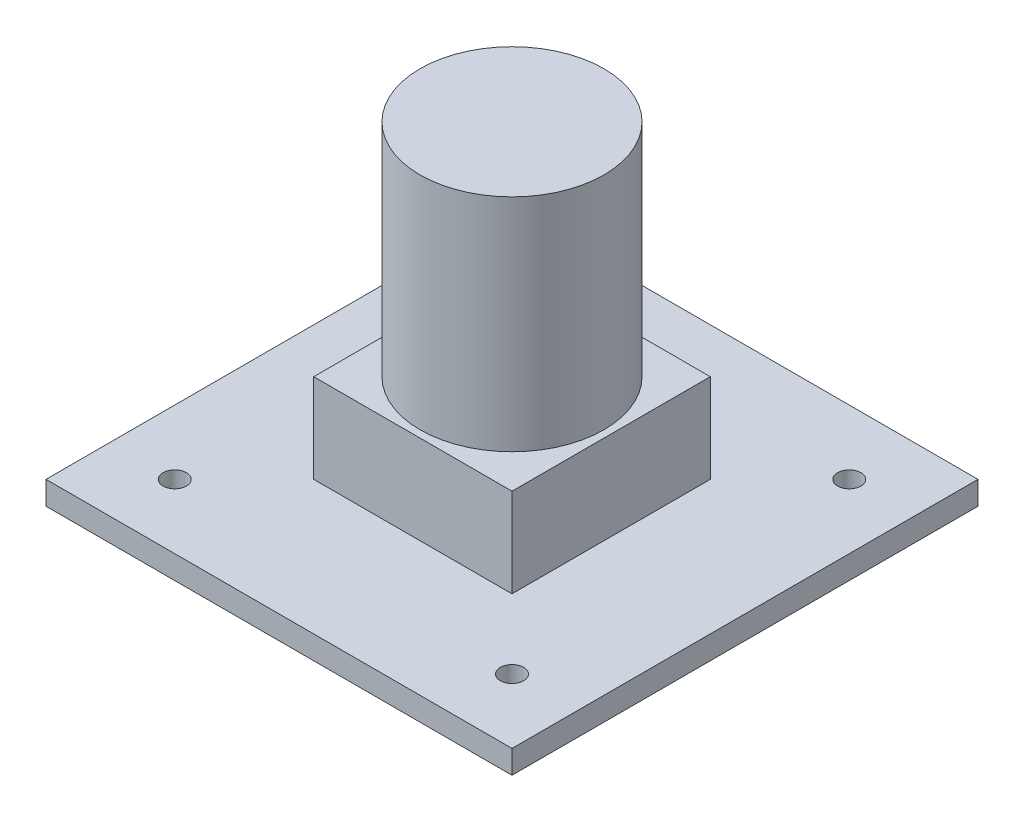
ISO-10303-21;
HEADER;
FILE_DESCRIPTION(('STEP AP214'),'2;1');
FILE_NAME('part.step','',(''),(''),'','','');
FILE_SCHEMA(('AUTOMOTIVE_DESIGN { 1 0 10303 214 1 1 1 1 }'));
ENDSEC;
DATA;
#1=APPLICATION_CONTEXT('core data for automotive mechanical design processes');
#2=APPLICATION_PROTOCOL_DEFINITION('international standard','automotive_design',2000,#1);
#3=PRODUCT_CONTEXT('',#1,'mechanical');
#4=PRODUCT('Part','Part','',(#3));
#5=PRODUCT_RELATED_PRODUCT_CATEGORY('part','',(#4));
#6=PRODUCT_DEFINITION_FORMATION('','',#4);
#7=PRODUCT_DEFINITION_CONTEXT('part definition',#1,'design');
#8=PRODUCT_DEFINITION('design','',#6,#7);
#9=PRODUCT_DEFINITION_SHAPE('','',#8);
#10=(LENGTH_UNIT() NAMED_UNIT(*) SI_UNIT(.MILLI.,.METRE.));
#11=(NAMED_UNIT(*) PLANE_ANGLE_UNIT() SI_UNIT($,.RADIAN.));
#12=(NAMED_UNIT(*) SI_UNIT($,.STERADIAN.) SOLID_ANGLE_UNIT());
#13=UNCERTAINTY_MEASURE_WITH_UNIT(LENGTH_MEASURE(1.E-05),#10,'distance_accuracy_value','');
#14=(GEOMETRIC_REPRESENTATION_CONTEXT(3) GLOBAL_UNCERTAINTY_ASSIGNED_CONTEXT((#13)) GLOBAL_UNIT_ASSIGNED_CONTEXT((#10,
#11,#12)) REPRESENTATION_CONTEXT('',''));
#15=CARTESIAN_POINT('',(0.,0.,0.));
#16=DIRECTION('',(0.,0.,1.));
#17=DIRECTION('',(1.,0.,0.));
#18=AXIS2_PLACEMENT_3D('',#15,#16,#17);
#19=CARTESIAN_POINT('',(0.,1.9,0.));
#20=DIRECTION('',(0.,1.,0.));
#21=DIRECTION('',(0.,0.,1.));
#22=AXIS2_PLACEMENT_3D('',#19,#20,#21);
#23=PLANE('',#22);
#24=CARTESIAN_POINT('',(-13.75,1.9,13.75));
#25=DIRECTION('',(0.,1.,0.));
#26=DIRECTION('',(0.,0.,1.));
#27=AXIS2_PLACEMENT_3D('',#24,#25,#26);
#28=CIRCLE('',#27,0.949999999999999);
#29=CARTESIAN_POINT('',(-13.75,1.9,14.7));
#30=VERTEX_POINT('',#29);
#31=EDGE_CURVE('E189',#30,#30,#28,.T.);
#32=ORIENTED_EDGE('',*,*,#31,.F.);
#33=EDGE_LOOP('',(#32));
#34=FACE_BOUND('',#33,.T.);
#35=CARTESIAN_POINT('',(13.75,1.9,13.75));
#36=DIRECTION('',(0.,1.,0.));
#37=DIRECTION('',(0.,0.,1.));
#38=AXIS2_PLACEMENT_3D('',#35,#36,#37);
#39=CIRCLE('',#38,0.949999999999999);
#40=CARTESIAN_POINT('',(13.75,1.9,14.7));
#41=VERTEX_POINT('',#40);
#42=EDGE_CURVE('E179',#41,#41,#39,.T.);
#43=ORIENTED_EDGE('',*,*,#42,.F.);
#44=EDGE_LOOP('',(#43));
#45=FACE_BOUND('',#44,.T.);
#46=CARTESIAN_POINT('',(13.75,1.9,-13.75));
#47=DIRECTION('',(0.,1.,0.));
#48=DIRECTION('',(0.,0.,1.));
#49=AXIS2_PLACEMENT_3D('',#46,#47,#48);
#50=CIRCLE('',#49,0.949999999999999);
#51=CARTESIAN_POINT('',(13.75,1.9,-12.8));
#52=VERTEX_POINT('',#51);
#53=EDGE_CURVE('E176',#52,#52,#50,.T.);
#54=ORIENTED_EDGE('',*,*,#53,.F.);
#55=EDGE_LOOP('',(#54));
#56=FACE_BOUND('',#55,.T.);
#57=CARTESIAN_POINT('',(-13.75,1.9,-13.75));
#58=DIRECTION('',(0.,1.,0.));
#59=DIRECTION('',(0.,0.,1.));
#60=AXIS2_PLACEMENT_3D('',#57,#58,#59);
#61=CIRCLE('',#60,0.949999999999999);
#62=CARTESIAN_POINT('',(-13.75,1.9,-12.8));
#63=VERTEX_POINT('',#62);
#64=EDGE_CURVE('E173',#63,#63,#61,.T.);
#65=ORIENTED_EDGE('',*,*,#64,.F.);
#66=EDGE_LOOP('',(#65));
#67=FACE_BOUND('',#66,.T.);
#68=DIRECTION('',(0.,0.,-1.));
#69=VECTOR('',#68,1.);
#70=CARTESIAN_POINT('',(19.,1.9,-19.));
#71=LINE('',#70,#69);
#72=CARTESIAN_POINT('',(19.,1.9,19.));
#73=VERTEX_POINT('',#72);
#74=CARTESIAN_POINT('',(19.,1.9,-19.));
#75=VERTEX_POINT('',#74);
#76=EDGE_CURVE('E153',#73,#75,#71,.T.);
#77=ORIENTED_EDGE('',*,*,#76,.T.);
#78=DIRECTION('',(-1.,0.,0.));
#79=VECTOR('',#78,1.);
#80=CARTESIAN_POINT('',(-19.,1.9,-19.));
#81=LINE('',#80,#79);
#82=CARTESIAN_POINT('',(-19.,1.9,-19.));
#83=VERTEX_POINT('',#82);
#84=EDGE_CURVE('E98',#75,#83,#81,.T.);
#85=ORIENTED_EDGE('',*,*,#84,.T.);
#86=DIRECTION('',(0.,0.,1.));
#87=VECTOR('',#86,1.);
#88=CARTESIAN_POINT('',(-19.,1.9,-19.));
#89=LINE('',#88,#87);
#90=CARTESIAN_POINT('',(-19.,1.9,19.));
#91=VERTEX_POINT('',#90);
#92=EDGE_CURVE('E156',#83,#91,#89,.T.);
#93=ORIENTED_EDGE('',*,*,#92,.T.);
#94=DIRECTION('',(1.,0.,0.));
#95=VECTOR('',#94,1.);
#96=CARTESIAN_POINT('',(-19.,1.9,19.));
#97=LINE('',#96,#95);
#98=EDGE_CURVE('E70',#91,#73,#97,.T.);
#99=ORIENTED_EDGE('',*,*,#98,.T.);
#100=EDGE_LOOP('',(#77,#85,#93,#99));
#101=FACE_BOUND('',#100,.T.);
#102=DIRECTION('',(-1.,0.,0.));
#103=VECTOR('',#102,1.);
#104=CARTESIAN_POINT('',(-8.085,1.9,-8.085));
#105=LINE('',#104,#103);
#106=CARTESIAN_POINT('',(8.085,1.9,-8.085));
#107=VERTEX_POINT('',#106);
#108=CARTESIAN_POINT('',(-8.085,1.9,-8.085));
#109=VERTEX_POINT('',#108);
#110=EDGE_CURVE('E203',#107,#109,#105,.T.);
#111=ORIENTED_EDGE('',*,*,#110,.F.);
#112=DIRECTION('',(0.,0.,-1.));
#113=VECTOR('',#112,1.);
#114=CARTESIAN_POINT('',(8.085,1.9,-8.085));
#115=LINE('',#114,#113);
#116=CARTESIAN_POINT('',(8.085,1.9,8.085));
#117=VERTEX_POINT('',#116);
#118=EDGE_CURVE('E143',#117,#107,#115,.T.);
#119=ORIENTED_EDGE('',*,*,#118,.F.);
#120=DIRECTION('',(1.,0.,0.));
#121=VECTOR('',#120,1.);
#122=CARTESIAN_POINT('',(-8.085,1.9,8.085));
#123=LINE('',#122,#121);
#124=CARTESIAN_POINT('',(-8.085,1.9,8.085));
#125=VERTEX_POINT('',#124);
#126=EDGE_CURVE('E139',#125,#117,#123,.T.);
#127=ORIENTED_EDGE('',*,*,#126,.F.);
#128=DIRECTION('',(0.,0.,1.));
#129=VECTOR('',#128,1.);
#130=CARTESIAN_POINT('',(-8.085,1.9,-8.085));
#131=LINE('',#130,#129);
#132=EDGE_CURVE('E205',#109,#125,#131,.T.);
#133=ORIENTED_EDGE('',*,*,#132,.F.);
#134=EDGE_LOOP('',(#111,#119,#127,#133));
#135=FACE_BOUND('',#134,.T.);
#136=ADVANCED_FACE('F44',(#34,#45,#56,#67,#101,#135),#23,.T.);
#137=CARTESIAN_POINT('',(19.,1.9,-19.));
#138=DIRECTION('',(-1.,0.,0.));
#139=DIRECTION('',(0.,0.,1.));
#140=AXIS2_PLACEMENT_3D('',#137,#138,#139);
#141=PLANE('',#140);
#142=DIRECTION('',(0.,0.,-1.));
#143=VECTOR('',#142,1.);
#144=CARTESIAN_POINT('',(19.,0.,-19.));
#145=LINE('',#144,#143);
#146=CARTESIAN_POINT('',(19.,0.,19.));
#147=VERTEX_POINT('',#146);
#148=CARTESIAN_POINT('',(19.,0.,-19.));
#149=VERTEX_POINT('',#148);
#150=EDGE_CURVE('E145',#147,#149,#145,.T.);
#151=ORIENTED_EDGE('',*,*,#150,.T.);
#152=DIRECTION('',(0.,-1.,0.));
#153=VECTOR('',#152,1.);
#154=CARTESIAN_POINT('',(19.,1.9,-19.));
#155=LINE('',#154,#153);
#156=EDGE_CURVE('E13',#75,#149,#155,.T.);
#157=ORIENTED_EDGE('',*,*,#156,.F.);
#158=ORIENTED_EDGE('',*,*,#76,.F.);
#159=DIRECTION('',(0.,-1.,0.));
#160=VECTOR('',#159,1.);
#161=CARTESIAN_POINT('',(19.,1.9,19.));
#162=LINE('',#161,#160);
#163=EDGE_CURVE('E158',#73,#147,#162,.T.);
#164=ORIENTED_EDGE('',*,*,#163,.T.);
#165=EDGE_LOOP('',(#151,#157,#158,#164));
#166=FACE_BOUND('',#165,.T.);
#167=ADVANCED_FACE('F46',(#166),#141,.F.);
#168=CARTESIAN_POINT('',(-19.,1.9,-19.));
#169=DIRECTION('',(0.,0.,1.));
#170=DIRECTION('',(1.,0.,0.));
#171=AXIS2_PLACEMENT_3D('',#168,#169,#170);
#172=PLANE('',#171);
#173=DIRECTION('',(-1.,0.,0.));
#174=VECTOR('',#173,1.);
#175=CARTESIAN_POINT('',(-19.,0.,-19.));
#176=LINE('',#175,#174);
#177=CARTESIAN_POINT('',(-19.,0.,-19.));
#178=VERTEX_POINT('',#177);
#179=EDGE_CURVE('E148',#149,#178,#176,.T.);
#180=ORIENTED_EDGE('',*,*,#179,.T.);
#181=DIRECTION('',(0.,-1.,0.));
#182=VECTOR('',#181,1.);
#183=CARTESIAN_POINT('',(-19.,1.9,-19.));
#184=LINE('',#183,#182);
#185=EDGE_CURVE('E53',#83,#178,#184,.T.);
#186=ORIENTED_EDGE('',*,*,#185,.F.);
#187=ORIENTED_EDGE('',*,*,#84,.F.);
#188=ORIENTED_EDGE('',*,*,#156,.T.);
#189=EDGE_LOOP('',(#180,#186,#187,#188));
#190=FACE_BOUND('',#189,.T.);
#191=ADVANCED_FACE('F230',(#190),#172,.F.);
#192=CARTESIAN_POINT('',(-19.,1.9,-19.));
#193=DIRECTION('',(1.,0.,0.));
#194=DIRECTION('',(0.,0.,-1.));
#195=AXIS2_PLACEMENT_3D('',#192,#193,#194);
#196=PLANE('',#195);
#197=DIRECTION('',(0.,0.,1.));
#198=VECTOR('',#197,1.);
#199=CARTESIAN_POINT('',(-19.,0.,-19.));
#200=LINE('',#199,#198);
#201=CARTESIAN_POINT('',(-19.,0.,19.));
#202=VERTEX_POINT('',#201);
#203=EDGE_CURVE('E161',#178,#202,#200,.T.);
#204=ORIENTED_EDGE('',*,*,#203,.T.);
#205=DIRECTION('',(0.,-1.,0.));
#206=VECTOR('',#205,1.);
#207=CARTESIAN_POINT('',(-19.,1.9,19.));
#208=LINE('',#207,#206);
#209=EDGE_CURVE('E165',#91,#202,#208,.T.);
#210=ORIENTED_EDGE('',*,*,#209,.F.);
#211=ORIENTED_EDGE('',*,*,#92,.F.);
#212=ORIENTED_EDGE('',*,*,#185,.T.);
#213=EDGE_LOOP('',(#204,#210,#211,#212));
#214=FACE_BOUND('',#213,.T.);
#215=ADVANCED_FACE('F244',(#214),#196,.F.);
#216=CARTESIAN_POINT('',(-19.,1.9,19.));
#217=DIRECTION('',(0.,0.,-1.));
#218=DIRECTION('',(-1.,0.,0.));
#219=AXIS2_PLACEMENT_3D('',#216,#217,#218);
#220=PLANE('',#219);
#221=DIRECTION('',(1.,0.,0.));
#222=VECTOR('',#221,1.);
#223=CARTESIAN_POINT('',(-19.,0.,19.));
#224=LINE('',#223,#222);
#225=EDGE_CURVE('E91',#202,#147,#224,.T.);
#226=ORIENTED_EDGE('',*,*,#225,.T.);
#227=ORIENTED_EDGE('',*,*,#163,.F.);
#228=ORIENTED_EDGE('',*,*,#98,.F.);
#229=ORIENTED_EDGE('',*,*,#209,.T.);
#230=EDGE_LOOP('',(#226,#227,#228,#229));
#231=FACE_BOUND('',#230,.T.);
#232=ADVANCED_FACE('F240',(#231),#220,.F.);
#233=CARTESIAN_POINT('',(0.,0.,0.));
#234=DIRECTION('',(0.,1.,0.));
#235=DIRECTION('',(0.,0.,1.));
#236=AXIS2_PLACEMENT_3D('',#233,#234,#235);
#237=PLANE('',#236);
#238=CARTESIAN_POINT('',(-13.75,0.,13.75));
#239=DIRECTION('',(0.,1.,0.));
#240=DIRECTION('',(0.,0.,1.));
#241=AXIS2_PLACEMENT_3D('',#238,#239,#240);
#242=CIRCLE('',#241,0.949999999999999);
#243=CARTESIAN_POINT('',(-13.75,0.,14.7));
#244=VERTEX_POINT('',#243);
#245=EDGE_CURVE('E48',#244,#244,#242,.T.);
#246=ORIENTED_EDGE('',*,*,#245,.T.);
#247=EDGE_LOOP('',(#246));
#248=FACE_BOUND('',#247,.T.);
#249=CARTESIAN_POINT('',(13.75,0.,13.75));
#250=DIRECTION('',(0.,1.,0.));
#251=DIRECTION('',(0.,0.,1.));
#252=AXIS2_PLACEMENT_3D('',#249,#250,#251);
#253=CIRCLE('',#252,0.949999999999999);
#254=CARTESIAN_POINT('',(13.75,0.,14.7));
#255=VERTEX_POINT('',#254);
#256=EDGE_CURVE('E177',#255,#255,#253,.T.);
#257=ORIENTED_EDGE('',*,*,#256,.T.);
#258=EDGE_LOOP('',(#257));
#259=FACE_BOUND('',#258,.T.);
#260=CARTESIAN_POINT('',(13.75,0.,-13.75));
#261=DIRECTION('',(0.,1.,0.));
#262=DIRECTION('',(0.,0.,1.));
#263=AXIS2_PLACEMENT_3D('',#260,#261,#262);
#264=CIRCLE('',#263,0.949999999999999);
#265=CARTESIAN_POINT('',(13.75,0.,-12.8));
#266=VERTEX_POINT('',#265);
#267=EDGE_CURVE('E174',#266,#266,#264,.T.);
#268=ORIENTED_EDGE('',*,*,#267,.T.);
#269=EDGE_LOOP('',(#268));
#270=FACE_BOUND('',#269,.T.);
#271=CARTESIAN_POINT('',(-13.75,0.,-13.75));
#272=DIRECTION('',(0.,1.,0.));
#273=DIRECTION('',(0.,0.,1.));
#274=AXIS2_PLACEMENT_3D('',#271,#272,#273);
#275=CIRCLE('',#274,0.949999999999999);
#276=CARTESIAN_POINT('',(-13.75,0.,-12.8));
#277=VERTEX_POINT('',#276);
#278=EDGE_CURVE('E169',#277,#277,#275,.T.);
#279=ORIENTED_EDGE('',*,*,#278,.T.);
#280=EDGE_LOOP('',(#279));
#281=FACE_BOUND('',#280,.T.);
#282=ORIENTED_EDGE('',*,*,#150,.F.);
#283=ORIENTED_EDGE('',*,*,#225,.F.);
#284=ORIENTED_EDGE('',*,*,#203,.F.);
#285=ORIENTED_EDGE('',*,*,#179,.F.);
#286=EDGE_LOOP('',(#282,#283,#284,#285));
#287=FACE_BOUND('',#286,.T.);
#288=ADVANCED_FACE('F237',(#248,#259,#270,#281,#287),#237,.F.);
#289=CARTESIAN_POINT('',(8.085,9.15,-8.085));
#290=DIRECTION('',(-1.,0.,0.));
#291=DIRECTION('',(0.,0.,1.));
#292=AXIS2_PLACEMENT_3D('',#289,#290,#291);
#293=PLANE('',#292);
#294=ORIENTED_EDGE('',*,*,#118,.T.);
#295=DIRECTION('',(0.,-1.,0.));
#296=VECTOR('',#295,1.);
#297=CARTESIAN_POINT('',(8.085,9.15,-8.085));
#298=LINE('',#297,#296);
#299=CARTESIAN_POINT('',(8.085,9.15,-8.085));
#300=VERTEX_POINT('',#299);
#301=EDGE_CURVE('E124',#300,#107,#298,.T.);
#302=ORIENTED_EDGE('',*,*,#301,.F.);
#303=DIRECTION('',(0.,0.,-1.));
#304=VECTOR('',#303,1.);
#305=CARTESIAN_POINT('',(8.085,9.15,-8.085));
#306=LINE('',#305,#304);
#307=CARTESIAN_POINT('',(8.085,9.15,8.085));
#308=VERTEX_POINT('',#307);
#309=EDGE_CURVE('E131',#308,#300,#306,.T.);
#310=ORIENTED_EDGE('',*,*,#309,.F.);
#311=DIRECTION('',(0.,-1.,0.));
#312=VECTOR('',#311,1.);
#313=CARTESIAN_POINT('',(8.085,9.15,8.085));
#314=LINE('',#313,#312);
#315=EDGE_CURVE('E201',#308,#117,#314,.T.);
#316=ORIENTED_EDGE('',*,*,#315,.T.);
#317=EDGE_LOOP('',(#294,#302,#310,#316));
#318=FACE_BOUND('',#317,.T.);
#319=ADVANCED_FACE('F141',(#318),#293,.F.);
#320=CARTESIAN_POINT('',(-8.085,9.15,-8.085));
#321=DIRECTION('',(0.,0.,1.));
#322=DIRECTION('',(1.,0.,0.));
#323=AXIS2_PLACEMENT_3D('',#320,#321,#322);
#324=PLANE('',#323);
#325=ORIENTED_EDGE('',*,*,#110,.T.);
#326=DIRECTION('',(0.,-1.,0.));
#327=VECTOR('',#326,1.);
#328=CARTESIAN_POINT('',(-8.085,9.15,-8.085));
#329=LINE('',#328,#327);
#330=CARTESIAN_POINT('',(-8.085,9.15,-8.085));
#331=VERTEX_POINT('',#330);
#332=EDGE_CURVE('E127',#331,#109,#329,.T.);
#333=ORIENTED_EDGE('',*,*,#332,.F.);
#334=DIRECTION('',(-1.,0.,0.));
#335=VECTOR('',#334,1.);
#336=CARTESIAN_POINT('',(-8.085,9.15,-8.085));
#337=LINE('',#336,#335);
#338=EDGE_CURVE('E120',#300,#331,#337,.T.);
#339=ORIENTED_EDGE('',*,*,#338,.F.);
#340=ORIENTED_EDGE('',*,*,#301,.T.);
#341=EDGE_LOOP('',(#325,#333,#339,#340));
#342=FACE_BOUND('',#341,.T.);
#343=ADVANCED_FACE('F122',(#342),#324,.F.);
#344=CARTESIAN_POINT('',(-8.085,9.15,-8.085));
#345=DIRECTION('',(1.,0.,0.));
#346=DIRECTION('',(0.,0.,-1.));
#347=AXIS2_PLACEMENT_3D('',#344,#345,#346);
#348=PLANE('',#347);
#349=ORIENTED_EDGE('',*,*,#132,.T.);
#350=DIRECTION('',(0.,-1.,0.));
#351=VECTOR('',#350,1.);
#352=CARTESIAN_POINT('',(-8.085,9.15,8.085));
#353=LINE('',#352,#351);
#354=CARTESIAN_POINT('',(-8.085,9.15,8.085));
#355=VERTEX_POINT('',#354);
#356=EDGE_CURVE('E61',#355,#125,#353,.T.);
#357=ORIENTED_EDGE('',*,*,#356,.F.);
#358=DIRECTION('',(0.,0.,1.));
#359=VECTOR('',#358,1.);
#360=CARTESIAN_POINT('',(-8.085,9.15,-8.085));
#361=LINE('',#360,#359);
#362=EDGE_CURVE('E130',#331,#355,#361,.T.);
#363=ORIENTED_EDGE('',*,*,#362,.F.);
#364=ORIENTED_EDGE('',*,*,#332,.T.);
#365=EDGE_LOOP('',(#349,#357,#363,#364));
#366=FACE_BOUND('',#365,.T.);
#367=ADVANCED_FACE('F212',(#366),#348,.F.);
#368=CARTESIAN_POINT('',(-8.085,9.15,8.085));
#369=DIRECTION('',(0.,0.,-1.));
#370=DIRECTION('',(-1.,0.,0.));
#371=AXIS2_PLACEMENT_3D('',#368,#369,#370);
#372=PLANE('',#371);
#373=ORIENTED_EDGE('',*,*,#126,.T.);
#374=ORIENTED_EDGE('',*,*,#315,.F.);
#375=DIRECTION('',(1.,0.,0.));
#376=VECTOR('',#375,1.);
#377=CARTESIAN_POINT('',(-8.085,9.15,8.085));
#378=LINE('',#377,#376);
#379=EDGE_CURVE('E135',#355,#308,#378,.T.);
#380=ORIENTED_EDGE('',*,*,#379,.F.);
#381=ORIENTED_EDGE('',*,*,#356,.T.);
#382=EDGE_LOOP('',(#373,#374,#380,#381));
#383=FACE_BOUND('',#382,.T.);
#384=ADVANCED_FACE('F213',(#383),#372,.F.);
#385=CARTESIAN_POINT('',(0.,9.15,0.));
#386=DIRECTION('',(0.,1.,0.));
#387=DIRECTION('',(0.,0.,1.));
#388=AXIS2_PLACEMENT_3D('',#385,#386,#387);
#389=PLANE('',#388);
#390=CARTESIAN_POINT('',(0.,9.15,0.));
#391=DIRECTION('',(0.,1.,0.));
#392=DIRECTION('',(0.,0.,1.));
#393=AXIS2_PLACEMENT_3D('',#390,#391,#392);
#394=CIRCLE('',#393,7.5);
#395=CARTESIAN_POINT('',(0.,9.15,7.5));
#396=VERTEX_POINT('',#395);
#397=EDGE_CURVE('E172',#396,#396,#394,.T.);
#398=ORIENTED_EDGE('',*,*,#397,.F.);
#399=EDGE_LOOP('',(#398));
#400=FACE_BOUND('',#399,.T.);
#401=ORIENTED_EDGE('',*,*,#309,.T.);
#402=ORIENTED_EDGE('',*,*,#338,.T.);
#403=ORIENTED_EDGE('',*,*,#362,.T.);
#404=ORIENTED_EDGE('',*,*,#379,.T.);
#405=EDGE_LOOP('',(#401,#402,#403,#404));
#406=FACE_BOUND('',#405,.T.);
#407=ADVANCED_FACE('F134',(#400,#406),#389,.T.);
#408=CARTESIAN_POINT('',(0.,27.15,0.));
#409=DIRECTION('',(0.,-1.,0.));
#410=DIRECTION('',(0.,0.,-1.));
#411=AXIS2_PLACEMENT_3D('',#408,#409,#410);
#412=CYLINDRICAL_SURFACE('',#411,7.5);
#413=CARTESIAN_POINT('',(0.,27.15,0.));
#414=DIRECTION('',(0.,1.,0.));
#415=DIRECTION('',(0.,0.,1.));
#416=AXIS2_PLACEMENT_3D('',#413,#414,#415);
#417=CIRCLE('',#416,7.5);
#418=CARTESIAN_POINT('',(0.,27.15,7.5));
#419=VERTEX_POINT('',#418);
#420=EDGE_CURVE('E194',#419,#419,#417,.T.);
#421=ORIENTED_EDGE('',*,*,#420,.F.);
#422=EDGE_LOOP('',(#421));
#423=FACE_BOUND('',#422,.T.);
#424=ORIENTED_EDGE('',*,*,#397,.T.);
#425=EDGE_LOOP('',(#424));
#426=FACE_BOUND('',#425,.T.);
#427=ADVANCED_FACE('F220',(#423,#426),#412,.T.);
#428=CARTESIAN_POINT('',(0.,27.15,0.));
#429=DIRECTION('',(0.,1.,0.));
#430=DIRECTION('',(0.,0.,1.));
#431=AXIS2_PLACEMENT_3D('',#428,#429,#430);
#432=PLANE('',#431);
#433=ORIENTED_EDGE('',*,*,#420,.T.);
#434=EDGE_LOOP('',(#433));
#435=FACE_BOUND('',#434,.T.);
#436=ADVANCED_FACE('F305',(#435),#432,.T.);
#437=CARTESIAN_POINT('',(-13.75,-16.1,-13.75));
#438=DIRECTION('',(0.,1.,0.));
#439=DIRECTION('',(0.,0.,1.));
#440=AXIS2_PLACEMENT_3D('',#437,#438,#439);
#441=CYLINDRICAL_SURFACE('',#440,0.949999999999999);
#442=ORIENTED_EDGE('',*,*,#64,.T.);
#443=EDGE_LOOP('',(#442));
#444=FACE_BOUND('',#443,.T.);
#445=ORIENTED_EDGE('',*,*,#278,.F.);
#446=EDGE_LOOP('',(#445));
#447=FACE_BOUND('',#446,.T.);
#448=ADVANCED_FACE('F314',(#444,#447),#441,.F.);
#449=CARTESIAN_POINT('',(13.75,-16.1,-13.75));
#450=DIRECTION('',(0.,1.,0.));
#451=DIRECTION('',(0.,0.,1.));
#452=AXIS2_PLACEMENT_3D('',#449,#450,#451);
#453=CYLINDRICAL_SURFACE('',#452,0.949999999999999);
#454=ORIENTED_EDGE('',*,*,#53,.T.);
#455=EDGE_LOOP('',(#454));
#456=FACE_BOUND('',#455,.T.);
#457=ORIENTED_EDGE('',*,*,#267,.F.);
#458=EDGE_LOOP('',(#457));
#459=FACE_BOUND('',#458,.T.);
#460=ADVANCED_FACE('F344',(#456,#459),#453,.F.);
#461=CARTESIAN_POINT('',(13.75,-16.1,13.75));
#462=DIRECTION('',(0.,1.,0.));
#463=DIRECTION('',(0.,0.,1.));
#464=AXIS2_PLACEMENT_3D('',#461,#462,#463);
#465=CYLINDRICAL_SURFACE('',#464,0.949999999999999);
#466=ORIENTED_EDGE('',*,*,#42,.T.);
#467=EDGE_LOOP('',(#466));
#468=FACE_BOUND('',#467,.T.);
#469=ORIENTED_EDGE('',*,*,#256,.F.);
#470=EDGE_LOOP('',(#469));
#471=FACE_BOUND('',#470,.T.);
#472=ADVANCED_FACE('F351',(#468,#471),#465,.F.);
#473=CARTESIAN_POINT('',(-13.75,-16.1,13.75));
#474=DIRECTION('',(0.,1.,0.));
#475=DIRECTION('',(0.,0.,1.));
#476=AXIS2_PLACEMENT_3D('',#473,#474,#475);
#477=CYLINDRICAL_SURFACE('',#476,0.949999999999999);
#478=ORIENTED_EDGE('',*,*,#31,.T.);
#479=EDGE_LOOP('',(#478));
#480=FACE_BOUND('',#479,.T.);
#481=ORIENTED_EDGE('',*,*,#245,.F.);
#482=EDGE_LOOP('',(#481));
#483=FACE_BOUND('',#482,.T.);
#484=ADVANCED_FACE('F359',(#480,#483),#477,.F.);
#485=CLOSED_SHELL('',(#136,#167,#191,#215,#232,#288,#319,#343,#367,#384,#407,#427,#436,#448,
#460,#472,#484));
#486=MANIFOLD_SOLID_BREP('B2',#485);
#487=ADVANCED_BREP_SHAPE_REPRESENTATION('',(#18,#486),#14);
#488=SHAPE_DEFINITION_REPRESENTATION(#9,#487);
ENDSEC;
END-ISO-10303-21;
